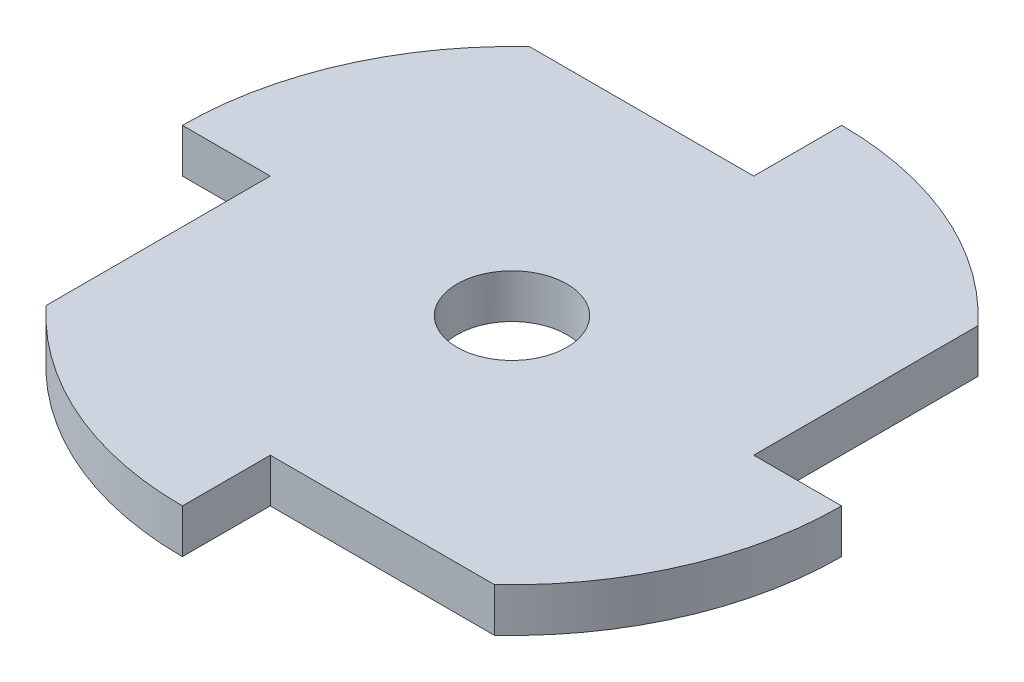
ISO-10303-21;
HEADER;
FILE_DESCRIPTION(('STEP AP214'),'2;1');
FILE_NAME('part.step','',(''),(''),'','','');
FILE_SCHEMA(('AUTOMOTIVE_DESIGN { 1 0 10303 214 1 1 1 1 }'));
ENDSEC;
DATA;
#1=APPLICATION_CONTEXT('core data for automotive mechanical design processes');
#2=APPLICATION_PROTOCOL_DEFINITION('international standard','automotive_design',2000,#1);
#3=PRODUCT_CONTEXT('',#1,'mechanical');
#4=PRODUCT('Part','Part','',(#3));
#5=PRODUCT_RELATED_PRODUCT_CATEGORY('part','',(#4));
#6=PRODUCT_DEFINITION_FORMATION('','',#4);
#7=PRODUCT_DEFINITION_CONTEXT('part definition',#1,'design');
#8=PRODUCT_DEFINITION('design','',#6,#7);
#9=PRODUCT_DEFINITION_SHAPE('','',#8);
#10=(LENGTH_UNIT() NAMED_UNIT(*) SI_UNIT(.MILLI.,.METRE.));
#11=(NAMED_UNIT(*) PLANE_ANGLE_UNIT() SI_UNIT($,.RADIAN.));
#12=(NAMED_UNIT(*) SI_UNIT($,.STERADIAN.) SOLID_ANGLE_UNIT());
#13=UNCERTAINTY_MEASURE_WITH_UNIT(LENGTH_MEASURE(1.E-05),#10,'distance_accuracy_value','');
#14=(GEOMETRIC_REPRESENTATION_CONTEXT(3) GLOBAL_UNCERTAINTY_ASSIGNED_CONTEXT((#13)) GLOBAL_UNIT_ASSIGNED_CONTEXT((#10,
#11,#12)) REPRESENTATION_CONTEXT('',''));
#15=CARTESIAN_POINT('',(0.,0.,0.));
#16=DIRECTION('',(0.,0.,1.));
#17=DIRECTION('',(1.,0.,0.));
#18=AXIS2_PLACEMENT_3D('',#15,#16,#17);
#19=CARTESIAN_POINT('',(0.,0.,0.));
#20=DIRECTION('',(0.,1.,0.));
#21=DIRECTION('',(1.,0.,0.));
#22=AXIS2_PLACEMENT_3D('',#19,#20,#21);
#23=PLANE('',#22);
#24=DIRECTION('',(1.,0.,0.));
#25=VECTOR('',#24,1.);
#26=CARTESIAN_POINT('',(5.5,0.,0.));
#27=LINE('',#26,#25);
#28=CARTESIAN_POINT('',(5.5,0.,0.));
#29=VERTEX_POINT('',#28);
#30=CARTESIAN_POINT('',(7.5,0.,0.));
#31=VERTEX_POINT('',#30);
#32=EDGE_CURVE('E11',#29,#31,#27,.T.);
#33=ORIENTED_EDGE('',*,*,#32,.T.);
#34=CARTESIAN_POINT('',(0.,0.,0.));
#35=DIRECTION('',(0.,-1.,0.));
#36=DIRECTION('',(1.,0.,0.));
#37=AXIS2_PLACEMENT_3D('',#34,#35,#36);
#38=CIRCLE('',#37,7.5);
#39=CARTESIAN_POINT('',(5.099019513593,0.,5.5));
#40=VERTEX_POINT('',#39);
#41=EDGE_CURVE('E27',#31,#40,#38,.T.);
#42=ORIENTED_EDGE('',*,*,#41,.T.);
#43=DIRECTION('',(-1.,0.,0.));
#44=VECTOR('',#43,1.);
#45=CARTESIAN_POINT('',(5.099019513593,0.,5.5));
#46=LINE('',#45,#44);
#47=CARTESIAN_POINT('',(0.,0.,5.5));
#48=VERTEX_POINT('',#47);
#49=EDGE_CURVE('E201',#40,#48,#46,.T.);
#50=ORIENTED_EDGE('',*,*,#49,.T.);
#51=DIRECTION('',(0.,0.,1.));
#52=VECTOR('',#51,1.);
#53=CARTESIAN_POINT('',(0.,0.,5.5));
#54=LINE('',#53,#52);
#55=CARTESIAN_POINT('',(0.,0.,7.5));
#56=VERTEX_POINT('',#55);
#57=EDGE_CURVE('E206',#48,#56,#54,.T.);
#58=ORIENTED_EDGE('',*,*,#57,.T.);
#59=CARTESIAN_POINT('',(0.,0.,0.));
#60=DIRECTION('',(0.,-1.,0.));
#61=DIRECTION('',(0.,0.,1.));
#62=AXIS2_PLACEMENT_3D('',#59,#60,#61);
#63=CIRCLE('',#62,7.5);
#64=CARTESIAN_POINT('',(-5.5,0.,5.099019513593));
#65=VERTEX_POINT('',#64);
#66=EDGE_CURVE('E209',#56,#65,#63,.T.);
#67=ORIENTED_EDGE('',*,*,#66,.T.);
#68=DIRECTION('',(0.,0.,-1.));
#69=VECTOR('',#68,1.);
#70=CARTESIAN_POINT('',(-5.5,0.,5.099019513593));
#71=LINE('',#70,#69);
#72=CARTESIAN_POINT('',(-5.5,0.,0.));
#73=VERTEX_POINT('',#72);
#74=EDGE_CURVE('E216',#65,#73,#71,.T.);
#75=ORIENTED_EDGE('',*,*,#74,.T.);
#76=DIRECTION('',(-1.,0.,0.));
#77=VECTOR('',#76,1.);
#78=CARTESIAN_POINT('',(-5.5,0.,0.));
#79=LINE('',#78,#77);
#80=CARTESIAN_POINT('',(-7.5,0.,0.));
#81=VERTEX_POINT('',#80);
#82=EDGE_CURVE('E219',#73,#81,#79,.T.);
#83=ORIENTED_EDGE('',*,*,#82,.T.);
#84=CARTESIAN_POINT('',(0.,0.,0.));
#85=DIRECTION('',(0.,-1.,0.));
#86=DIRECTION('',(-1.,0.,0.));
#87=AXIS2_PLACEMENT_3D('',#84,#85,#86);
#88=CIRCLE('',#87,7.5);
#89=CARTESIAN_POINT('',(-5.099019513593,0.,-5.5));
#90=VERTEX_POINT('',#89);
#91=EDGE_CURVE('E221',#81,#90,#88,.T.);
#92=ORIENTED_EDGE('',*,*,#91,.T.);
#93=DIRECTION('',(1.,0.,0.));
#94=VECTOR('',#93,1.);
#95=CARTESIAN_POINT('',(-5.099019513593,0.,-5.5));
#96=LINE('',#95,#94);
#97=CARTESIAN_POINT('',(0.,0.,-5.5));
#98=VERTEX_POINT('',#97);
#99=EDGE_CURVE('E168',#90,#98,#96,.T.);
#100=ORIENTED_EDGE('',*,*,#99,.T.);
#101=DIRECTION('',(0.,0.,1.));
#102=VECTOR('',#101,1.);
#103=CARTESIAN_POINT('',(0.,0.,-7.5));
#104=LINE('',#103,#102);
#105=CARTESIAN_POINT('',(0.,0.,-7.5));
#106=VERTEX_POINT('',#105);
#107=EDGE_CURVE('E157',#106,#98,#104,.T.);
#108=ORIENTED_EDGE('',*,*,#107,.F.);
#109=CARTESIAN_POINT('',(0.,0.,0.));
#110=DIRECTION('',(0.,-1.,0.));
#111=DIRECTION('',(0.,0.,-1.));
#112=AXIS2_PLACEMENT_3D('',#109,#110,#111);
#113=CIRCLE('',#112,7.5);
#114=CARTESIAN_POINT('',(5.5,0.,-5.099019513593));
#115=VERTEX_POINT('',#114);
#116=EDGE_CURVE('E170',#106,#115,#113,.T.);
#117=ORIENTED_EDGE('',*,*,#116,.T.);
#118=DIRECTION('',(0.,0.,1.));
#119=VECTOR('',#118,1.);
#120=CARTESIAN_POINT('',(5.5,0.,-5.099019513593));
#121=LINE('',#120,#119);
#122=EDGE_CURVE('E173',#115,#29,#121,.T.);
#123=ORIENTED_EDGE('',*,*,#122,.T.);
#124=EDGE_LOOP('',(#33,#42,#50,#58,#67,#75,#83,#92,#100,#108,#117,#123));
#125=FACE_BOUND('',#124,.T.);
#126=CARTESIAN_POINT('',(0.,0.,0.));
#127=DIRECTION('',(0.,-1.,0.));
#128=DIRECTION('',(-1.,0.,0.));
#129=AXIS2_PLACEMENT_3D('',#126,#127,#128);
#130=CIRCLE('',#129,1.25);
#131=CARTESIAN_POINT('',(-1.25,0.,0.));
#132=VERTEX_POINT('',#131);
#133=EDGE_CURVE('E176',#132,#132,#130,.T.);
#134=ORIENTED_EDGE('',*,*,#133,.F.);
#135=EDGE_LOOP('',(#134));
#136=FACE_BOUND('',#135,.T.);
#137=ADVANCED_FACE('F17',(#125,#136),#23,.F.);
#138=CARTESIAN_POINT('',(0.,0.,0.));
#139=DIRECTION('',(0.,1.,0.));
#140=DIRECTION('',(1.,0.,0.));
#141=AXIS2_PLACEMENT_3D('',#138,#139,#140);
#142=CYLINDRICAL_SURFACE('',#141,1.25);
#143=CARTESIAN_POINT('',(0.,1.,0.));
#144=DIRECTION('',(0.,-1.,0.));
#145=DIRECTION('',(1.,0.,0.));
#146=AXIS2_PLACEMENT_3D('',#143,#144,#145);
#147=CIRCLE('',#146,1.25);
#148=CARTESIAN_POINT('',(1.25,1.,0.));
#149=VERTEX_POINT('',#148);
#150=EDGE_CURVE('E180',#149,#149,#147,.T.);
#151=ORIENTED_EDGE('',*,*,#150,.F.);
#152=EDGE_LOOP('',(#151));
#153=FACE_BOUND('',#152,.T.);
#154=ORIENTED_EDGE('',*,*,#133,.T.);
#155=EDGE_LOOP('',(#154));
#156=FACE_BOUND('',#155,.T.);
#157=ADVANCED_FACE('F243',(#153,#156),#142,.F.);
#158=CARTESIAN_POINT('',(0.,1.,0.));
#159=DIRECTION('',(0.,1.,0.));
#160=DIRECTION('',(1.,0.,0.));
#161=AXIS2_PLACEMENT_3D('',#158,#159,#160);
#162=PLANE('',#161);
#163=CARTESIAN_POINT('',(0.,1.,0.));
#164=DIRECTION('',(0.,1.,0.));
#165=DIRECTION('',(0.733333333333337,0.,-0.679869268479034));
#166=AXIS2_PLACEMENT_3D('',#163,#164,#165);
#167=CIRCLE('',#166,7.5);
#168=CARTESIAN_POINT('',(5.5,1.,-5.099019513593));
#169=VERTEX_POINT('',#168);
#170=CARTESIAN_POINT('',(0.,1.,-7.5));
#171=VERTEX_POINT('',#170);
#172=EDGE_CURVE('E179',#169,#171,#167,.T.);
#173=ORIENTED_EDGE('',*,*,#172,.T.);
#174=DIRECTION('',(0.,0.,1.));
#175=VECTOR('',#174,1.);
#176=CARTESIAN_POINT('',(0.,1.,-7.5));
#177=LINE('',#176,#175);
#178=CARTESIAN_POINT('',(0.,1.,-5.5));
#179=VERTEX_POINT('',#178);
#180=EDGE_CURVE('E184',#171,#179,#177,.T.);
#181=ORIENTED_EDGE('',*,*,#180,.T.);
#182=DIRECTION('',(1.,0.,0.));
#183=VECTOR('',#182,1.);
#184=CARTESIAN_POINT('',(-5.099019513593,1.,-5.5));
#185=LINE('',#184,#183);
#186=CARTESIAN_POINT('',(-5.099019513593,1.,-5.5));
#187=VERTEX_POINT('',#186);
#188=EDGE_CURVE('E137',#187,#179,#185,.T.);
#189=ORIENTED_EDGE('',*,*,#188,.F.);
#190=CARTESIAN_POINT('',(0.,1.,0.));
#191=DIRECTION('',(0.,1.,0.));
#192=DIRECTION('',(-0.679869268479034,0.,-0.733333333333337));
#193=AXIS2_PLACEMENT_3D('',#190,#191,#192);
#194=CIRCLE('',#193,7.5);
#195=CARTESIAN_POINT('',(-7.5,1.,0.));
#196=VERTEX_POINT('',#195);
#197=EDGE_CURVE('E186',#187,#196,#194,.T.);
#198=ORIENTED_EDGE('',*,*,#197,.T.);
#199=DIRECTION('',(-1.,0.,0.));
#200=VECTOR('',#199,1.);
#201=CARTESIAN_POINT('',(-5.5,1.,0.));
#202=LINE('',#201,#200);
#203=CARTESIAN_POINT('',(-5.5,1.,0.));
#204=VERTEX_POINT('',#203);
#205=EDGE_CURVE('E132',#204,#196,#202,.T.);
#206=ORIENTED_EDGE('',*,*,#205,.F.);
#207=DIRECTION('',(0.,0.,-1.));
#208=VECTOR('',#207,1.);
#209=CARTESIAN_POINT('',(-5.5,1.,5.099019513593));
#210=LINE('',#209,#208);
#211=CARTESIAN_POINT('',(-5.5,1.,5.099019513593));
#212=VERTEX_POINT('',#211);
#213=EDGE_CURVE('E144',#212,#204,#210,.T.);
#214=ORIENTED_EDGE('',*,*,#213,.F.);
#215=CARTESIAN_POINT('',(0.,1.,0.));
#216=DIRECTION('',(0.,1.,0.));
#217=DIRECTION('',(-0.733333333333337,0.,0.679869268479034));
#218=AXIS2_PLACEMENT_3D('',#215,#216,#217);
#219=CIRCLE('',#218,7.5);
#220=CARTESIAN_POINT('',(0.,1.,7.5));
#221=VERTEX_POINT('',#220);
#222=EDGE_CURVE('E190',#212,#221,#219,.T.);
#223=ORIENTED_EDGE('',*,*,#222,.T.);
#224=DIRECTION('',(0.,0.,1.));
#225=VECTOR('',#224,1.);
#226=CARTESIAN_POINT('',(0.,1.,5.5));
#227=LINE('',#226,#225);
#228=CARTESIAN_POINT('',(0.,1.,5.5));
#229=VERTEX_POINT('',#228);
#230=EDGE_CURVE('E152',#229,#221,#227,.T.);
#231=ORIENTED_EDGE('',*,*,#230,.F.);
#232=DIRECTION('',(-1.,0.,0.));
#233=VECTOR('',#232,1.);
#234=CARTESIAN_POINT('',(5.099019513593,1.,5.5));
#235=LINE('',#234,#233);
#236=CARTESIAN_POINT('',(5.099019513593,1.,5.5));
#237=VERTEX_POINT('',#236);
#238=EDGE_CURVE('E153',#237,#229,#235,.T.);
#239=ORIENTED_EDGE('',*,*,#238,.F.);
#240=CARTESIAN_POINT('',(0.,1.,0.));
#241=DIRECTION('',(0.,1.,0.));
#242=DIRECTION('',(0.679869268479034,0.,0.733333333333337));
#243=AXIS2_PLACEMENT_3D('',#240,#241,#242);
#244=CIRCLE('',#243,7.5);
#245=CARTESIAN_POINT('',(7.5,1.,0.));
#246=VERTEX_POINT('',#245);
#247=EDGE_CURVE('E113',#237,#246,#244,.T.);
#248=ORIENTED_EDGE('',*,*,#247,.T.);
#249=DIRECTION('',(1.,0.,0.));
#250=VECTOR('',#249,1.);
#251=CARTESIAN_POINT('',(5.5,1.,0.));
#252=LINE('',#251,#250);
#253=CARTESIAN_POINT('',(5.5,1.,0.));
#254=VERTEX_POINT('',#253);
#255=EDGE_CURVE('E103',#254,#246,#252,.T.);
#256=ORIENTED_EDGE('',*,*,#255,.F.);
#257=DIRECTION('',(0.,0.,1.));
#258=VECTOR('',#257,1.);
#259=CARTESIAN_POINT('',(5.5,1.,-5.099019513593));
#260=LINE('',#259,#258);
#261=EDGE_CURVE('E110',#169,#254,#260,.T.);
#262=ORIENTED_EDGE('',*,*,#261,.F.);
#263=EDGE_LOOP('',(#173,#181,#189,#198,#206,#214,#223,#231,#239,#248,#256,#262));
#264=FACE_BOUND('',#263,.T.);
#265=ORIENTED_EDGE('',*,*,#150,.T.);
#266=EDGE_LOOP('',(#265));
#267=FACE_BOUND('',#266,.T.);
#268=ADVANCED_FACE('F108',(#264,#267),#162,.T.);
#269=CARTESIAN_POINT('',(5.5,1.,-5.099019513593));
#270=DIRECTION('',(-1.,0.,0.));
#271=DIRECTION('',(0.,0.,1.));
#272=AXIS2_PLACEMENT_3D('',#269,#270,#271);
#273=PLANE('',#272);
#274=DIRECTION('',(0.,1.,0.));
#275=VECTOR('',#274,1.);
#276=CARTESIAN_POINT('',(5.5,0.,-5.099019513593));
#277=LINE('',#276,#275);
#278=EDGE_CURVE('E122',#115,#169,#277,.T.);
#279=ORIENTED_EDGE('',*,*,#278,.T.);
#280=ORIENTED_EDGE('',*,*,#261,.T.);
#281=DIRECTION('',(0.,-1.,0.));
#282=VECTOR('',#281,1.);
#283=CARTESIAN_POINT('',(5.5,1.,0.));
#284=LINE('',#283,#282);
#285=EDGE_CURVE('E114',#254,#29,#284,.T.);
#286=ORIENTED_EDGE('',*,*,#285,.T.);
#287=ORIENTED_EDGE('',*,*,#122,.F.);
#288=EDGE_LOOP('',(#279,#280,#286,#287));
#289=FACE_BOUND('',#288,.T.);
#290=ADVANCED_FACE('F120',(#289),#273,.F.);
#291=CARTESIAN_POINT('',(5.5,1.,0.));
#292=DIRECTION('',(0.,0.,1.));
#293=DIRECTION('',(1.,0.,0.));
#294=AXIS2_PLACEMENT_3D('',#291,#292,#293);
#295=PLANE('',#294);
#296=ORIENTED_EDGE('',*,*,#285,.F.);
#297=ORIENTED_EDGE('',*,*,#255,.T.);
#298=DIRECTION('',(0.,1.,0.));
#299=VECTOR('',#298,1.);
#300=CARTESIAN_POINT('',(7.5,0.,0.));
#301=LINE('',#300,#299);
#302=EDGE_CURVE('E129',#31,#246,#301,.T.);
#303=ORIENTED_EDGE('',*,*,#302,.F.);
#304=ORIENTED_EDGE('',*,*,#32,.F.);
#305=EDGE_LOOP('',(#296,#297,#303,#304));
#306=FACE_BOUND('',#305,.T.);
#307=ADVANCED_FACE('F125',(#306),#295,.F.);
#308=CARTESIAN_POINT('',(0.,0.,0.));
#309=DIRECTION('',(0.,1.,0.));
#310=DIRECTION('',(1.,0.,0.));
#311=AXIS2_PLACEMENT_3D('',#308,#309,#310);
#312=CYLINDRICAL_SURFACE('',#311,7.5);
#313=ORIENTED_EDGE('',*,*,#197,.F.);
#314=DIRECTION('',(0.,1.,0.));
#315=VECTOR('',#314,1.);
#316=CARTESIAN_POINT('',(-5.099019513593,0.,-5.5));
#317=LINE('',#316,#315);
#318=EDGE_CURVE('E133',#90,#187,#317,.T.);
#319=ORIENTED_EDGE('',*,*,#318,.F.);
#320=ORIENTED_EDGE('',*,*,#91,.F.);
#321=DIRECTION('',(0.,1.,0.));
#322=VECTOR('',#321,1.);
#323=CARTESIAN_POINT('',(-7.5,0.,0.));
#324=LINE('',#323,#322);
#325=EDGE_CURVE('E115',#81,#196,#324,.T.);
#326=ORIENTED_EDGE('',*,*,#325,.T.);
#327=EDGE_LOOP('',(#313,#319,#320,#326));
#328=FACE_BOUND('',#327,.T.);
#329=ADVANCED_FACE('F228',(#328),#312,.T.);
#330=CARTESIAN_POINT('',(0.,0.,0.));
#331=DIRECTION('',(0.,1.,0.));
#332=DIRECTION('',(1.,0.,0.));
#333=AXIS2_PLACEMENT_3D('',#330,#331,#332);
#334=CYLINDRICAL_SURFACE('',#333,7.5);
#335=ORIENTED_EDGE('',*,*,#222,.F.);
#336=DIRECTION('',(0.,1.,0.));
#337=VECTOR('',#336,1.);
#338=CARTESIAN_POINT('',(-5.5,0.,5.099019513593));
#339=LINE('',#338,#337);
#340=EDGE_CURVE('E141',#65,#212,#339,.T.);
#341=ORIENTED_EDGE('',*,*,#340,.F.);
#342=ORIENTED_EDGE('',*,*,#66,.F.);
#343=DIRECTION('',(0.,1.,0.));
#344=VECTOR('',#343,1.);
#345=CARTESIAN_POINT('',(0.,0.,7.5));
#346=LINE('',#345,#344);
#347=EDGE_CURVE('E140',#56,#221,#346,.T.);
#348=ORIENTED_EDGE('',*,*,#347,.T.);
#349=EDGE_LOOP('',(#335,#341,#342,#348));
#350=FACE_BOUND('',#349,.T.);
#351=ADVANCED_FACE('F259',(#350),#334,.T.);
#352=CARTESIAN_POINT('',(0.,0.,0.));
#353=DIRECTION('',(0.,1.,0.));
#354=DIRECTION('',(1.,0.,0.));
#355=AXIS2_PLACEMENT_3D('',#352,#353,#354);
#356=CYLINDRICAL_SURFACE('',#355,7.5);
#357=ORIENTED_EDGE('',*,*,#116,.F.);
#358=DIRECTION('',(0.,1.,0.));
#359=VECTOR('',#358,1.);
#360=CARTESIAN_POINT('',(0.,0.,-7.5));
#361=LINE('',#360,#359);
#362=EDGE_CURVE('E131',#106,#171,#361,.T.);
#363=ORIENTED_EDGE('',*,*,#362,.T.);
#364=ORIENTED_EDGE('',*,*,#172,.F.);
#365=ORIENTED_EDGE('',*,*,#278,.F.);
#366=EDGE_LOOP('',(#357,#363,#364,#365));
#367=FACE_BOUND('',#366,.T.);
#368=ADVANCED_FACE('F262',(#367),#356,.T.);
#369=CARTESIAN_POINT('',(0.,0.,0.));
#370=DIRECTION('',(0.,1.,0.));
#371=DIRECTION('',(1.,0.,0.));
#372=AXIS2_PLACEMENT_3D('',#369,#370,#371);
#373=CYLINDRICAL_SURFACE('',#372,7.5);
#374=ORIENTED_EDGE('',*,*,#247,.F.);
#375=DIRECTION('',(0.,1.,0.));
#376=VECTOR('',#375,1.);
#377=CARTESIAN_POINT('',(5.099019513593,0.,5.5));
#378=LINE('',#377,#376);
#379=EDGE_CURVE('E149',#40,#237,#378,.T.);
#380=ORIENTED_EDGE('',*,*,#379,.F.);
#381=ORIENTED_EDGE('',*,*,#41,.F.);
#382=ORIENTED_EDGE('',*,*,#302,.T.);
#383=EDGE_LOOP('',(#374,#380,#381,#382));
#384=FACE_BOUND('',#383,.T.);
#385=ADVANCED_FACE('F266',(#384),#373,.T.);
#386=CARTESIAN_POINT('',(-5.5,1.,0.));
#387=DIRECTION('',(0.,0.,-1.));
#388=DIRECTION('',(-1.,0.,0.));
#389=AXIS2_PLACEMENT_3D('',#386,#387,#388);
#390=PLANE('',#389);
#391=DIRECTION('',(0.,-1.,0.));
#392=VECTOR('',#391,1.);
#393=CARTESIAN_POINT('',(-5.5,1.,0.));
#394=LINE('',#393,#392);
#395=EDGE_CURVE('E136',#204,#73,#394,.T.);
#396=ORIENTED_EDGE('',*,*,#395,.F.);
#397=ORIENTED_EDGE('',*,*,#205,.T.);
#398=ORIENTED_EDGE('',*,*,#325,.F.);
#399=ORIENTED_EDGE('',*,*,#82,.F.);
#400=EDGE_LOOP('',(#396,#397,#398,#399));
#401=FACE_BOUND('',#400,.T.);
#402=ADVANCED_FACE('F270',(#401),#390,.F.);
#403=CARTESIAN_POINT('',(-5.5,1.,5.099019513593));
#404=DIRECTION('',(1.,0.,0.));
#405=DIRECTION('',(0.,0.,-1.));
#406=AXIS2_PLACEMENT_3D('',#403,#404,#405);
#407=PLANE('',#406);
#408=ORIENTED_EDGE('',*,*,#340,.T.);
#409=ORIENTED_EDGE('',*,*,#213,.T.);
#410=ORIENTED_EDGE('',*,*,#395,.T.);
#411=ORIENTED_EDGE('',*,*,#74,.F.);
#412=EDGE_LOOP('',(#408,#409,#410,#411));
#413=FACE_BOUND('',#412,.T.);
#414=ADVANCED_FACE('F240',(#413),#407,.F.);
#415=CARTESIAN_POINT('',(-5.099019513593,1.,-5.5));
#416=DIRECTION('',(0.,0.,1.));
#417=DIRECTION('',(1.,0.,0.));
#418=AXIS2_PLACEMENT_3D('',#415,#416,#417);
#419=PLANE('',#418);
#420=ORIENTED_EDGE('',*,*,#318,.T.);
#421=ORIENTED_EDGE('',*,*,#188,.T.);
#422=DIRECTION('',(0.,-1.,0.));
#423=VECTOR('',#422,1.);
#424=CARTESIAN_POINT('',(0.,1.,-5.5));
#425=LINE('',#424,#423);
#426=EDGE_CURVE('E155',#179,#98,#425,.T.);
#427=ORIENTED_EDGE('',*,*,#426,.T.);
#428=ORIENTED_EDGE('',*,*,#99,.F.);
#429=EDGE_LOOP('',(#420,#421,#427,#428));
#430=FACE_BOUND('',#429,.T.);
#431=ADVANCED_FACE('F225',(#430),#419,.F.);
#432=CARTESIAN_POINT('',(0.,1.,-5.5));
#433=DIRECTION('',(1.,0.,0.));
#434=DIRECTION('',(0.,0.,-1.));
#435=AXIS2_PLACEMENT_3D('',#432,#433,#434);
#436=PLANE('',#435);
#437=ORIENTED_EDGE('',*,*,#426,.F.);
#438=ORIENTED_EDGE('',*,*,#180,.F.);
#439=ORIENTED_EDGE('',*,*,#362,.F.);
#440=ORIENTED_EDGE('',*,*,#107,.T.);
#441=EDGE_LOOP('',(#437,#438,#439,#440));
#442=FACE_BOUND('',#441,.T.);
#443=ADVANCED_FACE('F232',(#442),#436,.F.);
#444=CARTESIAN_POINT('',(0.,1.,5.5));
#445=DIRECTION('',(-1.,0.,0.));
#446=DIRECTION('',(0.,0.,1.));
#447=AXIS2_PLACEMENT_3D('',#444,#445,#446);
#448=PLANE('',#447);
#449=DIRECTION('',(0.,-1.,0.));
#450=VECTOR('',#449,1.);
#451=CARTESIAN_POINT('',(0.,1.,5.5));
#452=LINE('',#451,#450);
#453=EDGE_CURVE('E21',#229,#48,#452,.T.);
#454=ORIENTED_EDGE('',*,*,#453,.F.);
#455=ORIENTED_EDGE('',*,*,#230,.T.);
#456=ORIENTED_EDGE('',*,*,#347,.F.);
#457=ORIENTED_EDGE('',*,*,#57,.F.);
#458=EDGE_LOOP('',(#454,#455,#456,#457));
#459=FACE_BOUND('',#458,.T.);
#460=ADVANCED_FACE('F203',(#459),#448,.F.);
#461=CARTESIAN_POINT('',(5.099019513593,1.,5.5));
#462=DIRECTION('',(0.,0.,-1.));
#463=DIRECTION('',(-1.,0.,0.));
#464=AXIS2_PLACEMENT_3D('',#461,#462,#463);
#465=PLANE('',#464);
#466=ORIENTED_EDGE('',*,*,#379,.T.);
#467=ORIENTED_EDGE('',*,*,#238,.T.);
#468=ORIENTED_EDGE('',*,*,#453,.T.);
#469=ORIENTED_EDGE('',*,*,#49,.F.);
#470=EDGE_LOOP('',(#466,#467,#468,#469));
#471=FACE_BOUND('',#470,.T.);
#472=ADVANCED_FACE('F19',(#471),#465,.F.);
#473=CLOSED_SHELL('',(#137,#157,#268,#290,#307,#329,#351,#368,#385,#402,#414,#431,#443,#460,#472));
#474=MANIFOLD_SOLID_BREP('B1',#473);
#475=ADVANCED_BREP_SHAPE_REPRESENTATION('',(#18,#474),#14);
#476=SHAPE_DEFINITION_REPRESENTATION(#9,#475);
ENDSEC;
END-ISO-10303-21;
